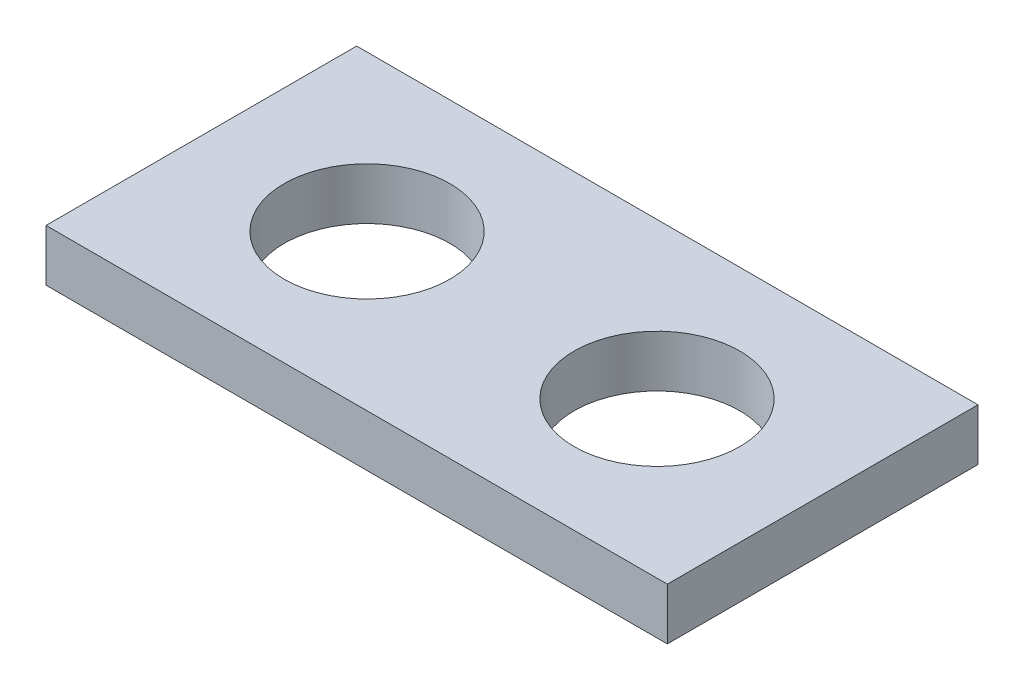
ISO-10303-21;
HEADER;
FILE_DESCRIPTION(('STEP AP214'),'2;1');
FILE_NAME('part.step','',(''),(''),'','','');
FILE_SCHEMA(('AUTOMOTIVE_DESIGN { 1 0 10303 214 1 1 1 1 }'));
ENDSEC;
DATA;
#1=APPLICATION_CONTEXT('core data for automotive mechanical design processes');
#2=APPLICATION_PROTOCOL_DEFINITION('international standard','automotive_design',2000,#1);
#3=PRODUCT_CONTEXT('',#1,'mechanical');
#4=PRODUCT('Part','Part','',(#3));
#5=PRODUCT_RELATED_PRODUCT_CATEGORY('part','',(#4));
#6=PRODUCT_DEFINITION_FORMATION('','',#4);
#7=PRODUCT_DEFINITION_CONTEXT('part definition',#1,'design');
#8=PRODUCT_DEFINITION('design','',#6,#7);
#9=PRODUCT_DEFINITION_SHAPE('','',#8);
#10=(LENGTH_UNIT() NAMED_UNIT(*) SI_UNIT(.MILLI.,.METRE.));
#11=(NAMED_UNIT(*) PLANE_ANGLE_UNIT() SI_UNIT($,.RADIAN.));
#12=(NAMED_UNIT(*) SI_UNIT($,.STERADIAN.) SOLID_ANGLE_UNIT());
#13=UNCERTAINTY_MEASURE_WITH_UNIT(LENGTH_MEASURE(1.E-05),#10,'distance_accuracy_value','');
#14=(GEOMETRIC_REPRESENTATION_CONTEXT(3) GLOBAL_UNCERTAINTY_ASSIGNED_CONTEXT((#13)) GLOBAL_UNIT_ASSIGNED_CONTEXT((#10,
#11,#12)) REPRESENTATION_CONTEXT('',''));
#15=CARTESIAN_POINT('',(0.,0.,0.));
#16=DIRECTION('',(0.,0.,1.));
#17=DIRECTION('',(1.,0.,0.));
#18=AXIS2_PLACEMENT_3D('',#15,#16,#17);
#19=CARTESIAN_POINT('',(0.,2.5,0.));
#20=DIRECTION('',(1.,0.,0.));
#21=DIRECTION('',(0.,0.,-1.));
#22=AXIS2_PLACEMENT_3D('',#19,#20,#21);
#23=PLANE('',#22);
#24=DIRECTION('',(0.,0.,1.));
#25=VECTOR('',#24,1.);
#26=CARTESIAN_POINT('',(0.,0.,0.));
#27=LINE('',#26,#25);
#28=CARTESIAN_POINT('',(0.,0.,-15.));
#29=VERTEX_POINT('',#28);
#30=CARTESIAN_POINT('',(0.,0.,0.));
#31=VERTEX_POINT('',#30);
#32=EDGE_CURVE('E115',#29,#31,#27,.T.);
#33=ORIENTED_EDGE('',*,*,#32,.T.);
#34=DIRECTION('',(0.,-1.,0.));
#35=VECTOR('',#34,1.);
#36=CARTESIAN_POINT('',(0.,2.5,0.));
#37=LINE('',#36,#35);
#38=CARTESIAN_POINT('',(0.,2.5,0.));
#39=VERTEX_POINT('',#38);
#40=EDGE_CURVE('E11',#39,#31,#37,.T.);
#41=ORIENTED_EDGE('',*,*,#40,.F.);
#42=DIRECTION('',(0.,0.,1.));
#43=VECTOR('',#42,1.);
#44=CARTESIAN_POINT('',(0.,2.5,0.));
#45=LINE('',#44,#43);
#46=CARTESIAN_POINT('',(0.,2.5,-15.));
#47=VERTEX_POINT('',#46);
#48=EDGE_CURVE('E98',#47,#39,#45,.T.);
#49=ORIENTED_EDGE('',*,*,#48,.F.);
#50=DIRECTION('',(0.,-1.,0.));
#51=VECTOR('',#50,1.);
#52=CARTESIAN_POINT('',(0.,2.5,-15.));
#53=LINE('',#52,#51);
#54=EDGE_CURVE('E111',#47,#29,#53,.T.);
#55=ORIENTED_EDGE('',*,*,#54,.T.);
#56=EDGE_LOOP('',(#33,#41,#49,#55));
#57=FACE_BOUND('',#56,.T.);
#58=ADVANCED_FACE('F46',(#57),#23,.F.);
#59=CARTESIAN_POINT('',(0.,2.5,0.));
#60=DIRECTION('',(0.,0.,-1.));
#61=DIRECTION('',(-1.,0.,0.));
#62=AXIS2_PLACEMENT_3D('',#59,#60,#61);
#63=PLANE('',#62);
#64=DIRECTION('',(1.,0.,0.));
#65=VECTOR('',#64,1.);
#66=CARTESIAN_POINT('',(0.,0.,0.));
#67=LINE('',#66,#65);
#68=CARTESIAN_POINT('',(30.,0.,0.));
#69=VERTEX_POINT('',#68);
#70=EDGE_CURVE('E103',#31,#69,#67,.T.);
#71=ORIENTED_EDGE('',*,*,#70,.T.);
#72=DIRECTION('',(0.,-1.,0.));
#73=VECTOR('',#72,1.);
#74=CARTESIAN_POINT('',(30.,2.5,0.));
#75=LINE('',#74,#73);
#76=CARTESIAN_POINT('',(30.,2.5,0.));
#77=VERTEX_POINT('',#76);
#78=EDGE_CURVE('E55',#77,#69,#75,.T.);
#79=ORIENTED_EDGE('',*,*,#78,.F.);
#80=DIRECTION('',(1.,0.,0.));
#81=VECTOR('',#80,1.);
#82=CARTESIAN_POINT('',(0.,2.5,0.));
#83=LINE('',#82,#81);
#84=EDGE_CURVE('E93',#39,#77,#83,.T.);
#85=ORIENTED_EDGE('',*,*,#84,.F.);
#86=ORIENTED_EDGE('',*,*,#40,.T.);
#87=EDGE_LOOP('',(#71,#79,#85,#86));
#88=FACE_BOUND('',#87,.T.);
#89=ADVANCED_FACE('F102',(#88),#63,.F.);
#90=CARTESIAN_POINT('',(30.,2.5,0.));
#91=DIRECTION('',(-1.,0.,0.));
#92=DIRECTION('',(0.,0.,1.));
#93=AXIS2_PLACEMENT_3D('',#90,#91,#92);
#94=PLANE('',#93);
#95=DIRECTION('',(0.,0.,-1.));
#96=VECTOR('',#95,1.);
#97=CARTESIAN_POINT('',(30.,0.,0.));
#98=LINE('',#97,#96);
#99=CARTESIAN_POINT('',(30.,0.,-15.));
#100=VERTEX_POINT('',#99);
#101=EDGE_CURVE('E80',#69,#100,#98,.T.);
#102=ORIENTED_EDGE('',*,*,#101,.T.);
#103=DIRECTION('',(0.,-1.,0.));
#104=VECTOR('',#103,1.);
#105=CARTESIAN_POINT('',(30.,2.5,-15.));
#106=LINE('',#105,#104);
#107=CARTESIAN_POINT('',(30.,2.5,-15.));
#108=VERTEX_POINT('',#107);
#109=EDGE_CURVE('E105',#108,#100,#106,.T.);
#110=ORIENTED_EDGE('',*,*,#109,.F.);
#111=DIRECTION('',(0.,0.,-1.));
#112=VECTOR('',#111,1.);
#113=CARTESIAN_POINT('',(30.,2.5,0.));
#114=LINE('',#113,#112);
#115=EDGE_CURVE('E96',#77,#108,#114,.T.);
#116=ORIENTED_EDGE('',*,*,#115,.F.);
#117=ORIENTED_EDGE('',*,*,#78,.T.);
#118=EDGE_LOOP('',(#102,#110,#116,#117));
#119=FACE_BOUND('',#118,.T.);
#120=ADVANCED_FACE('F106',(#119),#94,.F.);
#121=CARTESIAN_POINT('',(0.,2.5,-15.));
#122=DIRECTION('',(0.,0.,1.));
#123=DIRECTION('',(1.,0.,0.));
#124=AXIS2_PLACEMENT_3D('',#121,#122,#123);
#125=PLANE('',#124);
#126=DIRECTION('',(-1.,0.,0.));
#127=VECTOR('',#126,1.);
#128=CARTESIAN_POINT('',(0.,0.,-15.));
#129=LINE('',#128,#127);
#130=EDGE_CURVE('E86',#100,#29,#129,.T.);
#131=ORIENTED_EDGE('',*,*,#130,.T.);
#132=ORIENTED_EDGE('',*,*,#54,.F.);
#133=DIRECTION('',(-1.,0.,0.));
#134=VECTOR('',#133,1.);
#135=CARTESIAN_POINT('',(0.,2.5,-15.));
#136=LINE('',#135,#134);
#137=EDGE_CURVE('E63',#108,#47,#136,.T.);
#138=ORIENTED_EDGE('',*,*,#137,.F.);
#139=ORIENTED_EDGE('',*,*,#109,.T.);
#140=EDGE_LOOP('',(#131,#132,#138,#139));
#141=FACE_BOUND('',#140,.T.);
#142=ADVANCED_FACE('F129',(#141),#125,.F.);
#143=CARTESIAN_POINT('',(0.,2.5,0.));
#144=DIRECTION('',(0.,-1.,0.));
#145=DIRECTION('',(0.,0.,-1.));
#146=AXIS2_PLACEMENT_3D('',#143,#144,#145);
#147=PLANE('',#146);
#148=CARTESIAN_POINT('',(22.,2.5,-7.5));
#149=DIRECTION('',(0.,1.,0.));
#150=DIRECTION('',(0.,0.,1.));
#151=AXIS2_PLACEMENT_3D('',#148,#149,#150);
#152=CIRCLE('',#151,4.);
#153=CARTESIAN_POINT('',(22.,2.5,-3.5));
#154=VERTEX_POINT('',#153);
#155=EDGE_CURVE('E143',#154,#154,#152,.T.);
#156=ORIENTED_EDGE('',*,*,#155,.F.);
#157=EDGE_LOOP('',(#156));
#158=FACE_BOUND('',#157,.T.);
#159=CARTESIAN_POINT('',(8.,2.5,-7.5));
#160=DIRECTION('',(0.,1.,0.));
#161=DIRECTION('',(0.,0.,1.));
#162=AXIS2_PLACEMENT_3D('',#159,#160,#161);
#163=CIRCLE('',#162,4.);
#164=CARTESIAN_POINT('',(8.,2.5,-3.5));
#165=VERTEX_POINT('',#164);
#166=EDGE_CURVE('E140',#165,#165,#163,.T.);
#167=ORIENTED_EDGE('',*,*,#166,.F.);
#168=EDGE_LOOP('',(#167));
#169=FACE_BOUND('',#168,.T.);
#170=ORIENTED_EDGE('',*,*,#48,.T.);
#171=ORIENTED_EDGE('',*,*,#84,.T.);
#172=ORIENTED_EDGE('',*,*,#115,.T.);
#173=ORIENTED_EDGE('',*,*,#137,.T.);
#174=EDGE_LOOP('',(#170,#171,#172,#173));
#175=FACE_BOUND('',#174,.T.);
#176=ADVANCED_FACE('F94',(#158,#169,#175),#147,.F.);
#177=CARTESIAN_POINT('',(0.,0.,0.));
#178=DIRECTION('',(0.,-1.,0.));
#179=DIRECTION('',(0.,0.,-1.));
#180=AXIS2_PLACEMENT_3D('',#177,#178,#179);
#181=PLANE('',#180);
#182=CARTESIAN_POINT('',(22.,0.,-7.5));
#183=DIRECTION('',(0.,1.,0.));
#184=DIRECTION('',(0.,0.,1.));
#185=AXIS2_PLACEMENT_3D('',#182,#183,#184);
#186=CIRCLE('',#185,4.);
#187=CARTESIAN_POINT('',(22.,0.,-3.5));
#188=VERTEX_POINT('',#187);
#189=EDGE_CURVE('E119',#188,#188,#186,.T.);
#190=ORIENTED_EDGE('',*,*,#189,.T.);
#191=EDGE_LOOP('',(#190));
#192=FACE_BOUND('',#191,.T.);
#193=CARTESIAN_POINT('',(8.,0.,-7.5));
#194=DIRECTION('',(0.,1.,0.));
#195=DIRECTION('',(0.,0.,1.));
#196=AXIS2_PLACEMENT_3D('',#193,#194,#195);
#197=CIRCLE('',#196,4.);
#198=CARTESIAN_POINT('',(8.,0.,-3.5));
#199=VERTEX_POINT('',#198);
#200=EDGE_CURVE('E136',#199,#199,#197,.T.);
#201=ORIENTED_EDGE('',*,*,#200,.T.);
#202=EDGE_LOOP('',(#201));
#203=FACE_BOUND('',#202,.T.);
#204=ORIENTED_EDGE('',*,*,#32,.F.);
#205=ORIENTED_EDGE('',*,*,#130,.F.);
#206=ORIENTED_EDGE('',*,*,#101,.F.);
#207=ORIENTED_EDGE('',*,*,#70,.F.);
#208=EDGE_LOOP('',(#204,#205,#206,#207));
#209=FACE_BOUND('',#208,.T.);
#210=ADVANCED_FACE('F132',(#192,#203,#209),#181,.T.);
#211=CARTESIAN_POINT('',(8.,0.,-7.5));
#212=DIRECTION('',(0.,1.,0.));
#213=DIRECTION('',(0.,0.,1.));
#214=AXIS2_PLACEMENT_3D('',#211,#212,#213);
#215=CYLINDRICAL_SURFACE('',#214,4.);
#216=ORIENTED_EDGE('',*,*,#200,.F.);
#217=EDGE_LOOP('',(#216));
#218=FACE_BOUND('',#217,.T.);
#219=ORIENTED_EDGE('',*,*,#166,.T.);
#220=EDGE_LOOP('',(#219));
#221=FACE_BOUND('',#220,.T.);
#222=ADVANCED_FACE('F156',(#218,#221),#215,.F.);
#223=CARTESIAN_POINT('',(22.,0.,-7.5));
#224=DIRECTION('',(0.,1.,0.));
#225=DIRECTION('',(0.,0.,1.));
#226=AXIS2_PLACEMENT_3D('',#223,#224,#225);
#227=CYLINDRICAL_SURFACE('',#226,4.);
#228=ORIENTED_EDGE('',*,*,#189,.F.);
#229=EDGE_LOOP('',(#228));
#230=FACE_BOUND('',#229,.T.);
#231=ORIENTED_EDGE('',*,*,#155,.T.);
#232=EDGE_LOOP('',(#231));
#233=FACE_BOUND('',#232,.T.);
#234=ADVANCED_FACE('F153',(#230,#233),#227,.F.);
#235=CLOSED_SHELL('',(#58,#89,#120,#142,#176,#210,#222,#234));
#236=MANIFOLD_SOLID_BREP('B2',#235);
#237=ADVANCED_BREP_SHAPE_REPRESENTATION('',(#18,#236),#14);
#238=SHAPE_DEFINITION_REPRESENTATION(#9,#237);
ENDSEC;
END-ISO-10303-21;
